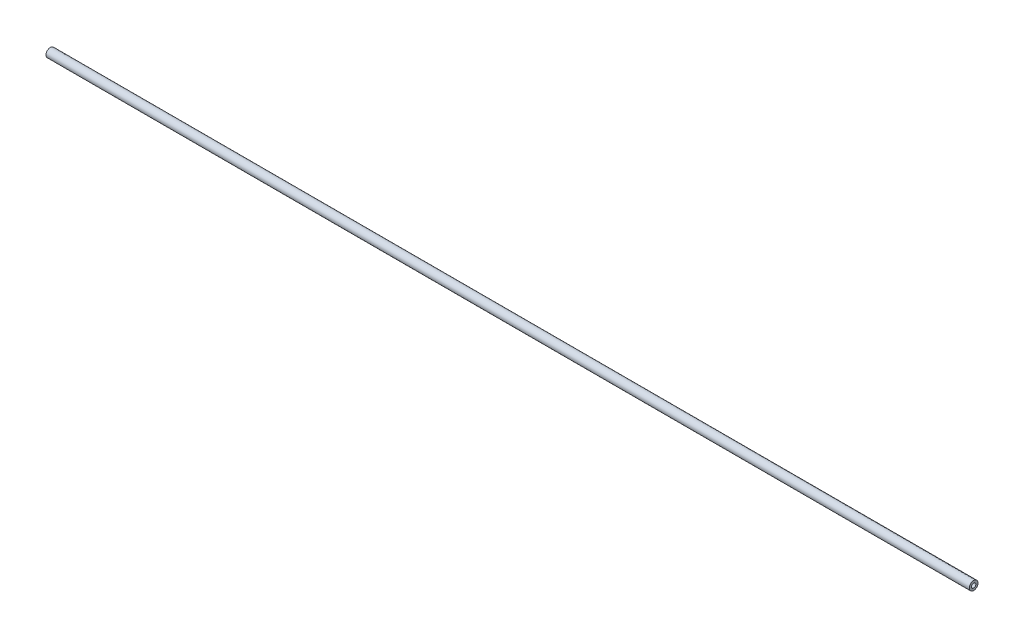
ISO-10303-21;
HEADER;
FILE_DESCRIPTION(('STEP AP214'),'2;1');
FILE_NAME('part.step','',(''),(''),'','','');
FILE_SCHEMA(('AUTOMOTIVE_DESIGN { 1 0 10303 214 1 1 1 1 }'));
ENDSEC;
DATA;
#1=APPLICATION_CONTEXT('core data for automotive mechanical design processes');
#2=APPLICATION_PROTOCOL_DEFINITION('international standard','automotive_design',2000,#1);
#3=PRODUCT_CONTEXT('',#1,'mechanical');
#4=PRODUCT('Part','Part','',(#3));
#5=PRODUCT_RELATED_PRODUCT_CATEGORY('part','',(#4));
#6=PRODUCT_DEFINITION_FORMATION('','',#4);
#7=PRODUCT_DEFINITION_CONTEXT('part definition',#1,'design');
#8=PRODUCT_DEFINITION('design','',#6,#7);
#9=PRODUCT_DEFINITION_SHAPE('','',#8);
#10=(LENGTH_UNIT() NAMED_UNIT(*) SI_UNIT(.MILLI.,.METRE.));
#11=(NAMED_UNIT(*) PLANE_ANGLE_UNIT() SI_UNIT($,.RADIAN.));
#12=(NAMED_UNIT(*) SI_UNIT($,.STERADIAN.) SOLID_ANGLE_UNIT());
#13=UNCERTAINTY_MEASURE_WITH_UNIT(LENGTH_MEASURE(1.E-05),#10,'distance_accuracy_value','');
#14=(GEOMETRIC_REPRESENTATION_CONTEXT(3) GLOBAL_UNCERTAINTY_ASSIGNED_CONTEXT((#13)) GLOBAL_UNIT_ASSIGNED_CONTEXT((#10,
#11,#12)) REPRESENTATION_CONTEXT('',''));
#15=CARTESIAN_POINT('',(0.,0.,0.));
#16=DIRECTION('',(0.,0.,1.));
#17=DIRECTION('',(1.,0.,0.));
#18=AXIS2_PLACEMENT_3D('',#15,#16,#17);
#19=CARTESIAN_POINT('',(317.5,0.,0.));
#20=DIRECTION('',(1.,0.,0.));
#21=DIRECTION('',(0.,0.,-1.));
#22=AXIS2_PLACEMENT_3D('',#19,#20,#21);
#23=PLANE('',#22);
#24=CARTESIAN_POINT('',(317.5,0.,0.));
#25=DIRECTION('',(1.,0.,0.));
#26=DIRECTION('',(0.,0.,-1.));
#27=AXIS2_PLACEMENT_3D('',#24,#25,#26);
#28=CIRCLE('',#27,3.);
#29=CARTESIAN_POINT('',(317.5,0.,3.));
#30=VERTEX_POINT('',#29);
#31=EDGE_CURVE('E10',#30,#30,#28,.T.);
#32=ORIENTED_EDGE('',*,*,#31,.T.);
#33=EDGE_LOOP('',(#32));
#34=FACE_BOUND('',#33,.T.);
#35=CARTESIAN_POINT('',(317.5,0.,0.));
#36=DIRECTION('',(1.,0.,0.));
#37=DIRECTION('',(0.,0.,-1.));
#38=AXIS2_PLACEMENT_3D('',#35,#36,#37);
#39=CIRCLE('',#38,1.5);
#40=CARTESIAN_POINT('',(317.5,0.,1.5));
#41=VERTEX_POINT('',#40);
#42=EDGE_CURVE('E55',#41,#41,#39,.T.);
#43=ORIENTED_EDGE('',*,*,#42,.F.);
#44=EDGE_LOOP('',(#43));
#45=FACE_BOUND('',#44,.T.);
#46=ADVANCED_FACE('F39',(#34,#45),#23,.T.);
#47=CARTESIAN_POINT('',(-317.5,0.,0.));
#48=DIRECTION('',(1.,0.,0.));
#49=DIRECTION('',(0.,0.,-1.));
#50=AXIS2_PLACEMENT_3D('',#47,#48,#49);
#51=PLANE('',#50);
#52=CARTESIAN_POINT('',(-317.5,0.,0.));
#53=DIRECTION('',(1.,0.,0.));
#54=DIRECTION('',(0.,0.,-1.));
#55=AXIS2_PLACEMENT_3D('',#52,#53,#54);
#56=CIRCLE('',#55,3.);
#57=CARTESIAN_POINT('',(-317.5,0.,3.));
#58=VERTEX_POINT('',#57);
#59=EDGE_CURVE('E43',#58,#58,#56,.T.);
#60=ORIENTED_EDGE('',*,*,#59,.F.);
#61=EDGE_LOOP('',(#60));
#62=FACE_BOUND('',#61,.T.);
#63=CARTESIAN_POINT('',(-317.5,0.,0.));
#64=DIRECTION('',(1.,0.,0.));
#65=DIRECTION('',(0.,0.,-1.));
#66=AXIS2_PLACEMENT_3D('',#63,#64,#65);
#67=CIRCLE('',#66,1.5);
#68=CARTESIAN_POINT('',(-317.5,0.,1.5));
#69=VERTEX_POINT('',#68);
#70=EDGE_CURVE('E53',#69,#69,#67,.T.);
#71=ORIENTED_EDGE('',*,*,#70,.T.);
#72=EDGE_LOOP('',(#71));
#73=FACE_BOUND('',#72,.T.);
#74=ADVANCED_FACE('F63',(#62,#73),#51,.F.);
#75=CARTESIAN_POINT('',(317.5,0.,0.));
#76=DIRECTION('',(-1.,0.,0.));
#77=DIRECTION('',(0.,0.,1.));
#78=AXIS2_PLACEMENT_3D('',#75,#76,#77);
#79=CYLINDRICAL_SURFACE('',#78,3.);
#80=CARTESIAN_POINT('',(317.5,0.,3.));
#81=CARTESIAN_POINT('',(310.885416666667,0.,3.));
#82=CARTESIAN_POINT('',(304.270833333333,0.,3.));
#83=CARTESIAN_POINT('',(291.041666666667,0.,3.));
#84=CARTESIAN_POINT('',(284.427083333333,0.,3.));
#85=CARTESIAN_POINT('',(271.197916666667,0.,3.));
#86=CARTESIAN_POINT('',(264.583333333333,0.,3.));
#87=CARTESIAN_POINT('',(251.354166666667,0.,3.));
#88=CARTESIAN_POINT('',(244.739583333333,0.,3.));
#89=CARTESIAN_POINT('',(231.510416666667,0.,3.));
#90=CARTESIAN_POINT('',(224.895833333333,0.,3.));
#91=CARTESIAN_POINT('',(211.666666666667,0.,3.));
#92=CARTESIAN_POINT('',(205.052083333333,0.,3.));
#93=CARTESIAN_POINT('',(191.822916666667,0.,3.));
#94=CARTESIAN_POINT('',(185.208333333333,0.,3.));
#95=CARTESIAN_POINT('',(171.979166666667,0.,3.));
#96=CARTESIAN_POINT('',(165.364583333333,0.,3.));
#97=CARTESIAN_POINT('',(152.135416666667,0.,3.));
#98=CARTESIAN_POINT('',(145.520833333333,0.,3.));
#99=CARTESIAN_POINT('',(132.291666666667,0.,3.));
#100=CARTESIAN_POINT('',(125.677083333333,0.,3.));
#101=CARTESIAN_POINT('',(112.447916666667,0.,3.));
#102=CARTESIAN_POINT('',(105.833333333333,0.,3.));
#103=CARTESIAN_POINT('',(92.6041666666666,0.,3.));
#104=CARTESIAN_POINT('',(85.9895833333332,0.,3.));
#105=CARTESIAN_POINT('',(72.7604166666666,0.,3.));
#106=CARTESIAN_POINT('',(66.1458333333333,0.,3.));
#107=CARTESIAN_POINT('',(52.9166666666666,0.,3.));
#108=CARTESIAN_POINT('',(46.3020833333332,0.,3.));
#109=CARTESIAN_POINT('',(33.0729166666666,0.,3.));
#110=CARTESIAN_POINT('',(26.4583333333332,0.,3.));
#111=CARTESIAN_POINT('',(13.2291666666665,0.,3.));
#112=CARTESIAN_POINT('',(6.61458333333322,0.,3.));
#113=CARTESIAN_POINT('',(-6.61458333333344,0.,3.));
#114=CARTESIAN_POINT('',(-13.2291666666668,0.,3.));
#115=CARTESIAN_POINT('',(-26.4583333333334,0.,3.));
#116=CARTESIAN_POINT('',(-33.0729166666668,0.,3.));
#117=CARTESIAN_POINT('',(-46.3020833333334,0.,3.));
#118=CARTESIAN_POINT('',(-52.9166666666668,0.,3.));
#119=CARTESIAN_POINT('',(-66.1458333333335,0.,3.));
#120=CARTESIAN_POINT('',(-72.7604166666668,0.,3.));
#121=CARTESIAN_POINT('',(-85.9895833333335,0.,3.));
#122=CARTESIAN_POINT('',(-92.6041666666668,0.,3.));
#123=CARTESIAN_POINT('',(-105.833333333333,0.,3.));
#124=CARTESIAN_POINT('',(-112.447916666667,0.,3.));
#125=CARTESIAN_POINT('',(-125.677083333334,0.,3.));
#126=CARTESIAN_POINT('',(-132.291666666667,0.,3.));
#127=CARTESIAN_POINT('',(-145.520833333334,0.,3.));
#128=CARTESIAN_POINT('',(-152.135416666667,0.,3.));
#129=CARTESIAN_POINT('',(-165.364583333334,0.,3.));
#130=CARTESIAN_POINT('',(-171.979166666667,0.,3.));
#131=CARTESIAN_POINT('',(-185.208333333333,0.,3.));
#132=CARTESIAN_POINT('',(-191.822916666667,0.,3.));
#133=CARTESIAN_POINT('',(-205.052083333333,0.,3.));
#134=CARTESIAN_POINT('',(-211.666666666667,0.,3.));
#135=CARTESIAN_POINT('',(-224.895833333333,0.,3.));
#136=CARTESIAN_POINT('',(-231.510416666667,0.,3.));
#137=CARTESIAN_POINT('',(-244.739583333333,0.,3.));
#138=CARTESIAN_POINT('',(-251.354166666667,0.,3.));
#139=CARTESIAN_POINT('',(-264.583333333333,0.,3.));
#140=CARTESIAN_POINT('',(-271.197916666667,0.,3.));
#141=CARTESIAN_POINT('',(-284.427083333333,0.,3.));
#142=CARTESIAN_POINT('',(-291.041666666667,0.,3.));
#143=CARTESIAN_POINT('',(-304.270833333333,0.,3.));
#144=CARTESIAN_POINT('',(-310.885416666667,0.,3.));
#145=CARTESIAN_POINT('',(-317.5,0.,3.));
#146=B_SPLINE_CURVE_WITH_KNOTS('',3,(#80,#81,#82,#83,#84,#85,#86,#87,#88,#89,#90,#91,#92,#93,
#94,#95,#96,#97,#98,#99,#100,#101,#102,#103,#104,#105,#106,#107,#108,#109,#110,#111,#112,#113,
#114,#115,#116,#117,#118,#119,#120,#121,#122,#123,#124,#125,#126,#127,#128,#129,#130,#131,#132,
#133,#134,#135,#136,#137,#138,#139,#140,#141,#142,#143,#144,#145),.UNSPECIFIED.,.F.,.F.,(4,2,2,
2,2,2,2,2,2,2,2,2,2,2,2,2,2,2,2,2,2,2,2,2,2,2,2,2,2,2,2,2,4),(0.,19.84375,39.6875,59.53125,
79.375,99.21875,119.0625,138.90625,158.75,178.59375,198.4375,218.28125,238.125,257.96875,
277.8125,297.65625,317.5,337.34375,357.1875,377.03125,396.875,416.71875,436.5625,456.40625,
476.25,496.09375,515.9375,535.78125,555.625,575.46875,595.3125,615.15625,635.),.UNSPECIFIED.);
#147=EDGE_CURVE('BSEAM41',#30,#58,#146,.T.);
#148=ORIENTED_EDGE('',*,*,#31,.F.);
#149=ORIENTED_EDGE('',*,*,#59,.T.);
#150=ORIENTED_EDGE('',*,*,#147,.T.);
#151=ORIENTED_EDGE('',*,*,#147,.F.);
#152=EDGE_LOOP('',(#148,#150,#149,#151));
#153=FACE_BOUND('',#152,.T.);
#154=ADVANCED_FACE('F41',(#153),#79,.T.);
#155=CARTESIAN_POINT('',(317.5,0.,0.));
#156=DIRECTION('',(-1.,0.,0.));
#157=DIRECTION('',(0.,0.,1.));
#158=AXIS2_PLACEMENT_3D('',#155,#156,#157);
#159=CYLINDRICAL_SURFACE('',#158,1.5);
#160=CARTESIAN_POINT('',(317.5,0.,1.5));
#161=CARTESIAN_POINT('',(310.885416666667,0.,1.5));
#162=CARTESIAN_POINT('',(304.270833333333,0.,1.5));
#163=CARTESIAN_POINT('',(291.041666666667,0.,1.5));
#164=CARTESIAN_POINT('',(284.427083333333,0.,1.5));
#165=CARTESIAN_POINT('',(271.197916666667,0.,1.5));
#166=CARTESIAN_POINT('',(264.583333333333,0.,1.5));
#167=CARTESIAN_POINT('',(251.354166666667,0.,1.5));
#168=CARTESIAN_POINT('',(244.739583333333,0.,1.5));
#169=CARTESIAN_POINT('',(231.510416666667,0.,1.5));
#170=CARTESIAN_POINT('',(224.895833333333,0.,1.5));
#171=CARTESIAN_POINT('',(211.666666666667,0.,1.5));
#172=CARTESIAN_POINT('',(205.052083333333,0.,1.5));
#173=CARTESIAN_POINT('',(191.822916666667,0.,1.5));
#174=CARTESIAN_POINT('',(185.208333333333,0.,1.5));
#175=CARTESIAN_POINT('',(171.979166666667,0.,1.5));
#176=CARTESIAN_POINT('',(165.364583333333,0.,1.5));
#177=CARTESIAN_POINT('',(152.135416666667,0.,1.5));
#178=CARTESIAN_POINT('',(145.520833333333,0.,1.5));
#179=CARTESIAN_POINT('',(132.291666666667,0.,1.5));
#180=CARTESIAN_POINT('',(125.677083333333,0.,1.5));
#181=CARTESIAN_POINT('',(112.447916666667,0.,1.5));
#182=CARTESIAN_POINT('',(105.833333333333,0.,1.5));
#183=CARTESIAN_POINT('',(92.6041666666666,0.,1.5));
#184=CARTESIAN_POINT('',(85.9895833333332,0.,1.5));
#185=CARTESIAN_POINT('',(72.7604166666666,0.,1.5));
#186=CARTESIAN_POINT('',(66.1458333333333,0.,1.5));
#187=CARTESIAN_POINT('',(52.9166666666666,0.,1.5));
#188=CARTESIAN_POINT('',(46.3020833333333,0.,1.5));
#189=CARTESIAN_POINT('',(33.0729166666666,0.,1.5));
#190=CARTESIAN_POINT('',(26.4583333333333,0.,1.5));
#191=CARTESIAN_POINT('',(13.2291666666666,0.,1.5));
#192=CARTESIAN_POINT('',(6.61458333333328,0.,1.5));
#193=CARTESIAN_POINT('',(-6.61458333333339,0.,1.5));
#194=CARTESIAN_POINT('',(-13.2291666666667,0.,1.5));
#195=CARTESIAN_POINT('',(-26.4583333333334,0.,1.5));
#196=CARTESIAN_POINT('',(-33.0729166666667,0.,1.5));
#197=CARTESIAN_POINT('',(-46.3020833333334,0.,1.5));
#198=CARTESIAN_POINT('',(-52.9166666666667,0.,1.5));
#199=CARTESIAN_POINT('',(-66.1458333333334,0.,1.5));
#200=CARTESIAN_POINT('',(-72.7604166666668,0.,1.5));
#201=CARTESIAN_POINT('',(-85.9895833333334,0.,1.5));
#202=CARTESIAN_POINT('',(-92.6041666666668,0.,1.5));
#203=CARTESIAN_POINT('',(-105.833333333333,0.,1.5));
#204=CARTESIAN_POINT('',(-112.447916666667,0.,1.5));
#205=CARTESIAN_POINT('',(-125.677083333333,0.,1.5));
#206=CARTESIAN_POINT('',(-132.291666666667,0.,1.5));
#207=CARTESIAN_POINT('',(-145.520833333333,0.,1.5));
#208=CARTESIAN_POINT('',(-152.135416666667,0.,1.5));
#209=CARTESIAN_POINT('',(-165.364583333333,0.,1.5));
#210=CARTESIAN_POINT('',(-171.979166666667,0.,1.5));
#211=CARTESIAN_POINT('',(-185.208333333333,0.,1.5));
#212=CARTESIAN_POINT('',(-191.822916666667,0.,1.5));
#213=CARTESIAN_POINT('',(-205.052083333333,0.,1.5));
#214=CARTESIAN_POINT('',(-211.666666666667,0.,1.5));
#215=CARTESIAN_POINT('',(-224.895833333333,0.,1.5));
#216=CARTESIAN_POINT('',(-231.510416666667,0.,1.5));
#217=CARTESIAN_POINT('',(-244.739583333333,0.,1.5));
#218=CARTESIAN_POINT('',(-251.354166666667,0.,1.5));
#219=CARTESIAN_POINT('',(-264.583333333333,0.,1.5));
#220=CARTESIAN_POINT('',(-271.197916666667,0.,1.5));
#221=CARTESIAN_POINT('',(-284.427083333333,0.,1.5));
#222=CARTESIAN_POINT('',(-291.041666666667,0.,1.5));
#223=CARTESIAN_POINT('',(-304.270833333333,0.,1.5));
#224=CARTESIAN_POINT('',(-310.885416666667,0.,1.5));
#225=CARTESIAN_POINT('',(-317.5,0.,1.5));
#226=B_SPLINE_CURVE_WITH_KNOTS('',3,(#160,#161,#162,#163,#164,#165,#166,#167,#168,#169,#170,
#171,#172,#173,#174,#175,#176,#177,#178,#179,#180,#181,#182,#183,#184,#185,#186,#187,#188,#189,
#190,#191,#192,#193,#194,#195,#196,#197,#198,#199,#200,#201,#202,#203,#204,#205,#206,#207,#208,
#209,#210,#211,#212,#213,#214,#215,#216,#217,#218,#219,#220,#221,#222,#223,#224,#225),
.UNSPECIFIED.,.F.,.F.,(4,2,2,2,2,2,2,2,2,2,2,2,2,2,2,2,2,2,2,2,2,2,2,2,2,2,2,2,2,2,2,2,4),(0.,
19.84375,39.6875,59.53125,79.375,99.2187500000001,119.0625,138.90625,158.75,178.59375,198.4375,
218.28125,238.125,257.96875,277.8125,297.65625,317.5,337.34375,357.1875,377.03125,396.875,
416.71875,436.5625,456.40625,476.25,496.09375,515.9375,535.78125,555.625,575.46875,595.3125,
615.15625,635.),.UNSPECIFIED.);
#227=EDGE_CURVE('BSEAM58',#41,#69,#226,.T.);
#228=ORIENTED_EDGE('',*,*,#42,.T.);
#229=ORIENTED_EDGE('',*,*,#70,.F.);
#230=ORIENTED_EDGE('',*,*,#227,.T.);
#231=ORIENTED_EDGE('',*,*,#227,.F.);
#232=EDGE_LOOP('',(#228,#230,#229,#231));
#233=FACE_BOUND('',#232,.T.);
#234=ADVANCED_FACE('F58',(#233),#159,.F.);
#235=CLOSED_SHELL('',(#46,#74,#154,#234));
#236=MANIFOLD_SOLID_BREP('B2',#235);
#237=ADVANCED_BREP_SHAPE_REPRESENTATION('',(#18,#236),#14);
#238=SHAPE_DEFINITION_REPRESENTATION(#9,#237);
ENDSEC;
END-ISO-10303-21;
